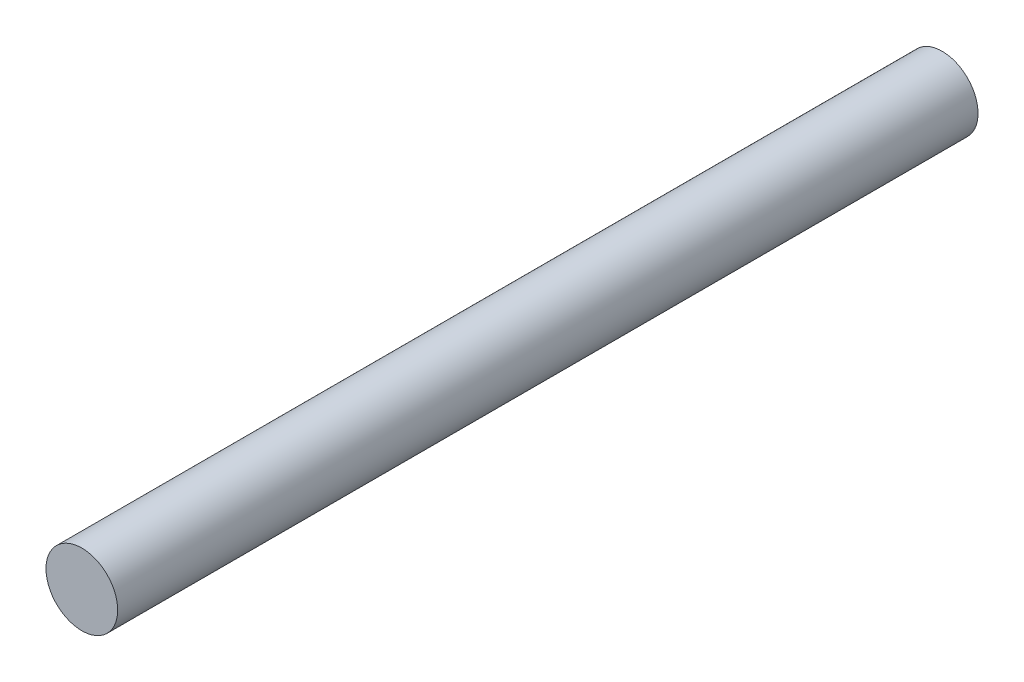
ISO-10303-21;
HEADER;
FILE_DESCRIPTION(('STEP AP214'),'2;1');
FILE_NAME('part.step','',(''),(''),'','','');
FILE_SCHEMA(('AUTOMOTIVE_DESIGN { 1 0 10303 214 1 1 1 1 }'));
ENDSEC;
DATA;
#1=APPLICATION_CONTEXT('core data for automotive mechanical design processes');
#2=APPLICATION_PROTOCOL_DEFINITION('international standard','automotive_design',2000,#1);
#3=PRODUCT_CONTEXT('',#1,'mechanical');
#4=PRODUCT('Part','Part','',(#3));
#5=PRODUCT_RELATED_PRODUCT_CATEGORY('part','',(#4));
#6=PRODUCT_DEFINITION_FORMATION('','',#4);
#7=PRODUCT_DEFINITION_CONTEXT('part definition',#1,'design');
#8=PRODUCT_DEFINITION('design','',#6,#7);
#9=PRODUCT_DEFINITION_SHAPE('','',#8);
#10=(LENGTH_UNIT() NAMED_UNIT(*) SI_UNIT(.MILLI.,.METRE.));
#11=(NAMED_UNIT(*) PLANE_ANGLE_UNIT() SI_UNIT($,.RADIAN.));
#12=(NAMED_UNIT(*) SI_UNIT($,.STERADIAN.) SOLID_ANGLE_UNIT());
#13=UNCERTAINTY_MEASURE_WITH_UNIT(LENGTH_MEASURE(1.E-05),#10,'distance_accuracy_value','');
#14=(GEOMETRIC_REPRESENTATION_CONTEXT(3) GLOBAL_UNCERTAINTY_ASSIGNED_CONTEXT((#13)) GLOBAL_UNIT_ASSIGNED_CONTEXT((#10,
#11,#12)) REPRESENTATION_CONTEXT('',''));
#15=CARTESIAN_POINT('',(0.,0.,0.));
#16=DIRECTION('',(0.,0.,1.));
#17=DIRECTION('',(1.,0.,0.));
#18=AXIS2_PLACEMENT_3D('',#15,#16,#17);
#19=CARTESIAN_POINT('',(0.,0.,152.4));
#20=DIRECTION('',(0.,0.,-1.));
#21=DIRECTION('',(-1.,0.,0.));
#22=AXIS2_PLACEMENT_3D('',#19,#20,#21);
#23=CYLINDRICAL_SURFACE('',#22,12.7);
#24=CARTESIAN_POINT('',(0.,0.,152.4));
#25=DIRECTION('',(0.,0.,1.));
#26=DIRECTION('',(1.,0.,0.));
#27=AXIS2_PLACEMENT_3D('',#24,#25,#26);
#28=CIRCLE('',#27,12.7);
#29=CARTESIAN_POINT('',(-12.7,0.,152.4));
#30=VERTEX_POINT('',#29);
#31=EDGE_CURVE('E10',#30,#30,#28,.T.);
#32=CARTESIAN_POINT('',(0.,0.,-152.4));
#33=DIRECTION('',(0.,0.,1.));
#34=DIRECTION('',(1.,0.,0.));
#35=AXIS2_PLACEMENT_3D('',#32,#33,#34);
#36=CIRCLE('',#35,12.7);
#37=CARTESIAN_POINT('',(-12.7,0.,-152.4));
#38=VERTEX_POINT('',#37);
#39=EDGE_CURVE('E40',#38,#38,#36,.T.);
#40=CARTESIAN_POINT('',(-12.7,0.,152.4));
#41=CARTESIAN_POINT('',(-12.7,0.,149.225));
#42=CARTESIAN_POINT('',(-12.7,0.,146.05));
#43=CARTESIAN_POINT('',(-12.7,0.,139.7));
#44=CARTESIAN_POINT('',(-12.7,0.,136.525));
#45=CARTESIAN_POINT('',(-12.7,0.,130.175));
#46=CARTESIAN_POINT('',(-12.7,0.,127.));
#47=CARTESIAN_POINT('',(-12.7,0.,120.65));
#48=CARTESIAN_POINT('',(-12.7,0.,117.475));
#49=CARTESIAN_POINT('',(-12.7,0.,111.125));
#50=CARTESIAN_POINT('',(-12.7,0.,107.95));
#51=CARTESIAN_POINT('',(-12.7,0.,101.6));
#52=CARTESIAN_POINT('',(-12.7,0.,98.425));
#53=CARTESIAN_POINT('',(-12.7,0.,92.075));
#54=CARTESIAN_POINT('',(-12.7,0.,88.9));
#55=CARTESIAN_POINT('',(-12.7,0.,82.55));
#56=CARTESIAN_POINT('',(-12.7,0.,79.375));
#57=CARTESIAN_POINT('',(-12.7,0.,73.025));
#58=CARTESIAN_POINT('',(-12.7,0.,69.85));
#59=CARTESIAN_POINT('',(-12.7,0.,63.5));
#60=CARTESIAN_POINT('',(-12.7,0.,60.325));
#61=CARTESIAN_POINT('',(-12.7,0.,53.975));
#62=CARTESIAN_POINT('',(-12.7,0.,50.8));
#63=CARTESIAN_POINT('',(-12.7,0.,44.45));
#64=CARTESIAN_POINT('',(-12.7,0.,41.275));
#65=CARTESIAN_POINT('',(-12.7,0.,34.925));
#66=CARTESIAN_POINT('',(-12.7,0.,31.75));
#67=CARTESIAN_POINT('',(-12.7,0.,25.4));
#68=CARTESIAN_POINT('',(-12.7,0.,22.225));
#69=CARTESIAN_POINT('',(-12.7,0.,15.875));
#70=CARTESIAN_POINT('',(-12.7,0.,12.7));
#71=CARTESIAN_POINT('',(-12.7,0.,6.35));
#72=CARTESIAN_POINT('',(-12.7,0.,3.175));
#73=CARTESIAN_POINT('',(-12.7,0.,-3.175));
#74=CARTESIAN_POINT('',(-12.7,0.,-6.35));
#75=CARTESIAN_POINT('',(-12.7,0.,-12.7));
#76=CARTESIAN_POINT('',(-12.7,0.,-15.875));
#77=CARTESIAN_POINT('',(-12.7,0.,-22.225));
#78=CARTESIAN_POINT('',(-12.7,0.,-25.4));
#79=CARTESIAN_POINT('',(-12.7,0.,-31.75));
#80=CARTESIAN_POINT('',(-12.7,0.,-34.925));
#81=CARTESIAN_POINT('',(-12.7,0.,-41.275));
#82=CARTESIAN_POINT('',(-12.7,0.,-44.45));
#83=CARTESIAN_POINT('',(-12.7,0.,-50.8));
#84=CARTESIAN_POINT('',(-12.7,0.,-53.975));
#85=CARTESIAN_POINT('',(-12.7,0.,-60.325));
#86=CARTESIAN_POINT('',(-12.7,0.,-63.5));
#87=CARTESIAN_POINT('',(-12.7,0.,-69.85));
#88=CARTESIAN_POINT('',(-12.7,0.,-73.025));
#89=CARTESIAN_POINT('',(-12.7,0.,-79.375));
#90=CARTESIAN_POINT('',(-12.7,0.,-82.55));
#91=CARTESIAN_POINT('',(-12.7,0.,-88.9));
#92=CARTESIAN_POINT('',(-12.7,0.,-92.075));
#93=CARTESIAN_POINT('',(-12.7,0.,-98.425));
#94=CARTESIAN_POINT('',(-12.7,0.,-101.6));
#95=CARTESIAN_POINT('',(-12.7,0.,-107.95));
#96=CARTESIAN_POINT('',(-12.7,0.,-111.125));
#97=CARTESIAN_POINT('',(-12.7,0.,-117.475));
#98=CARTESIAN_POINT('',(-12.7,0.,-120.65));
#99=CARTESIAN_POINT('',(-12.7,0.,-127.));
#100=CARTESIAN_POINT('',(-12.7,0.,-130.175));
#101=CARTESIAN_POINT('',(-12.7,0.,-136.525));
#102=CARTESIAN_POINT('',(-12.7,0.,-139.7));
#103=CARTESIAN_POINT('',(-12.7,0.,-146.05));
#104=CARTESIAN_POINT('',(-12.7,0.,-149.225));
#105=CARTESIAN_POINT('',(-12.7,0.,-152.4));
#106=B_SPLINE_CURVE_WITH_KNOTS('',3,(#40,#41,#42,#43,#44,#45,#46,#47,#48,#49,#50,#51,#52,#53,
#54,#55,#56,#57,#58,#59,#60,#61,#62,#63,#64,#65,#66,#67,#68,#69,#70,#71,#72,#73,#74,#75,#76,#77,
#78,#79,#80,#81,#82,#83,#84,#85,#86,#87,#88,#89,#90,#91,#92,#93,#94,#95,#96,#97,#98,#99,#100,
#101,#102,#103,#104,#105),.UNSPECIFIED.,.F.,.F.,(4,2,2,2,2,2,2,2,2,2,2,2,2,2,2,2,2,2,2,2,2,2,2,
2,2,2,2,2,2,2,2,2,4),(0.,9.52500000000001,19.05,28.575,38.1,47.625,57.15,66.675,76.2,85.725,
95.25,104.775,114.3,123.825,133.35,142.875,152.4,161.925,171.45,180.975,190.5,200.025,209.55,
219.075,228.6,238.125,247.65,257.175,266.7,276.225,285.75,295.275,304.8),.UNSPECIFIED.);
#107=EDGE_CURVE('BSEAM37',#30,#38,#106,.T.);
#108=ORIENTED_EDGE('',*,*,#31,.F.);
#109=ORIENTED_EDGE('',*,*,#39,.T.);
#110=ORIENTED_EDGE('',*,*,#107,.T.);
#111=ORIENTED_EDGE('',*,*,#107,.F.);
#112=EDGE_LOOP('',(#108,#110,#109,#111));
#113=FACE_BOUND('',#112,.T.);
#114=ADVANCED_FACE('F37',(#113),#23,.T.);
#115=CARTESIAN_POINT('',(0.,0.,152.4));
#116=DIRECTION('',(0.,0.,1.));
#117=DIRECTION('',(1.,0.,0.));
#118=AXIS2_PLACEMENT_3D('',#115,#116,#117);
#119=PLANE('',#118);
#120=ORIENTED_EDGE('',*,*,#31,.T.);
#121=EDGE_LOOP('',(#120));
#122=FACE_BOUND('',#121,.T.);
#123=ADVANCED_FACE('F54',(#122),#119,.T.);
#124=CARTESIAN_POINT('',(0.,0.,-152.4));
#125=DIRECTION('',(0.,0.,1.));
#126=DIRECTION('',(1.,0.,0.));
#127=AXIS2_PLACEMENT_3D('',#124,#125,#126);
#128=PLANE('',#127);
#129=ORIENTED_EDGE('',*,*,#39,.F.);
#130=EDGE_LOOP('',(#129));
#131=FACE_BOUND('',#130,.T.);
#132=ADVANCED_FACE('F52',(#131),#128,.F.);
#133=CLOSED_SHELL('',(#114,#123,#132));
#134=MANIFOLD_SOLID_BREP('B2',#133);
#135=ADVANCED_BREP_SHAPE_REPRESENTATION('',(#18,#134),#14);
#136=SHAPE_DEFINITION_REPRESENTATION(#9,#135);
ENDSEC;
END-ISO-10303-21;
